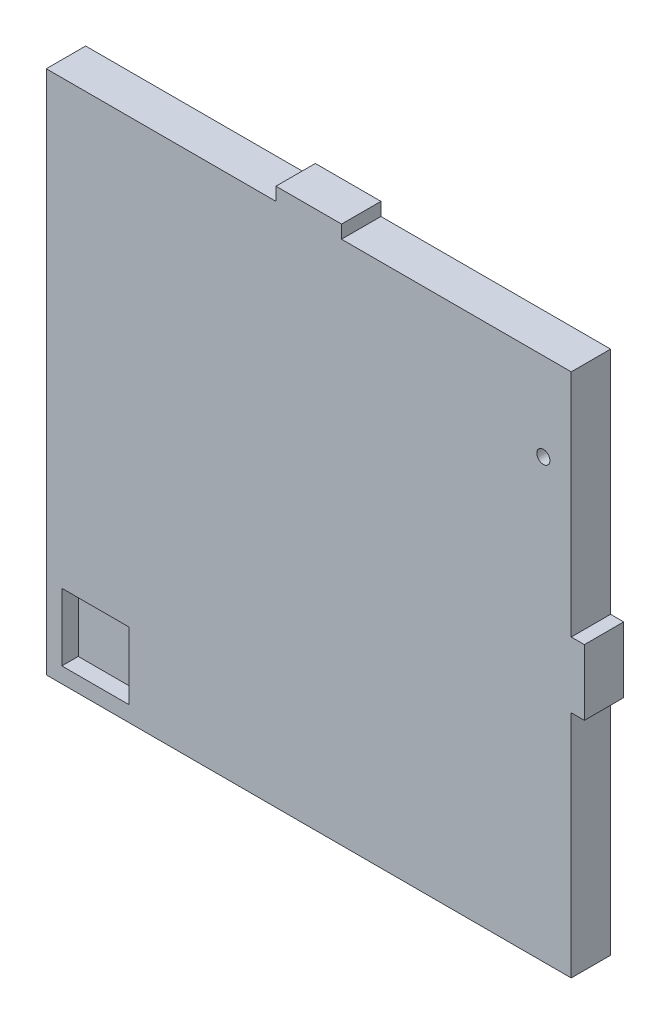
ISO-10303-21;
HEADER;
FILE_DESCRIPTION(('STEP AP214'),'2;1');
FILE_NAME('part.step','',(''),(''),'','','');
FILE_SCHEMA(('AUTOMOTIVE_DESIGN { 1 0 10303 214 1 1 1 1 }'));
ENDSEC;
DATA;
#1=APPLICATION_CONTEXT('core data for automotive mechanical design processes');
#2=APPLICATION_PROTOCOL_DEFINITION('international standard','automotive_design',2000,#1);
#3=PRODUCT_CONTEXT('',#1,'mechanical');
#4=PRODUCT('Part','Part','',(#3));
#5=PRODUCT_RELATED_PRODUCT_CATEGORY('part','',(#4));
#6=PRODUCT_DEFINITION_FORMATION('','',#4);
#7=PRODUCT_DEFINITION_CONTEXT('part definition',#1,'design');
#8=PRODUCT_DEFINITION('design','',#6,#7);
#9=PRODUCT_DEFINITION_SHAPE('','',#8);
#10=(LENGTH_UNIT() NAMED_UNIT(*) SI_UNIT(.MILLI.,.METRE.));
#11=(NAMED_UNIT(*) PLANE_ANGLE_UNIT() SI_UNIT($,.RADIAN.));
#12=(NAMED_UNIT(*) SI_UNIT($,.STERADIAN.) SOLID_ANGLE_UNIT());
#13=UNCERTAINTY_MEASURE_WITH_UNIT(LENGTH_MEASURE(1.E-05),#10,'distance_accuracy_value','');
#14=(GEOMETRIC_REPRESENTATION_CONTEXT(3) GLOBAL_UNCERTAINTY_ASSIGNED_CONTEXT((#13)) GLOBAL_UNIT_ASSIGNED_CONTEXT((#10,
#11,#12)) REPRESENTATION_CONTEXT('',''));
#15=CARTESIAN_POINT('',(0.,0.,0.));
#16=DIRECTION('',(0.,0.,1.));
#17=DIRECTION('',(1.,0.,0.));
#18=AXIS2_PLACEMENT_3D('',#15,#16,#17);
#19=CARTESIAN_POINT('',(151.500000000024,133.299999999993,12.));
#20=DIRECTION('',(0.,0.,-1.));
#21=DIRECTION('',(-1.,0.,0.));
#22=AXIS2_PLACEMENT_3D('',#19,#20,#21);
#23=CYLINDRICAL_SURFACE('',#22,2.);
#24=CARTESIAN_POINT('',(151.500000000024,133.299999999993,12.));
#25=DIRECTION('',(0.,0.,1.));
#26=DIRECTION('',(1.,0.,0.));
#27=AXIS2_PLACEMENT_3D('',#24,#25,#26);
#28=CIRCLE('',#27,2.);
#29=CARTESIAN_POINT('',(153.500000000024,133.299999999993,12.));
#30=VERTEX_POINT('',#29);
#31=EDGE_CURVE('E184',#30,#30,#28,.T.);
#32=ORIENTED_EDGE('',*,*,#31,.T.);
#33=EDGE_LOOP('',(#32));
#34=FACE_BOUND('',#33,.T.);
#35=CARTESIAN_POINT('',(151.500000000024,133.299999999993,8.));
#36=DIRECTION('',(0.,0.,-1.));
#37=DIRECTION('',(-1.,0.,0.));
#38=AXIS2_PLACEMENT_3D('',#35,#36,#37);
#39=CIRCLE('',#38,2.);
#40=CARTESIAN_POINT('',(149.500000000024,133.299999999993,8.));
#41=VERTEX_POINT('',#40);
#42=EDGE_CURVE('E44',#41,#41,#39,.T.);
#43=ORIENTED_EDGE('',*,*,#42,.T.);
#44=EDGE_LOOP('',(#43));
#45=FACE_BOUND('',#44,.T.);
#46=ADVANCED_FACE('F41',(#34,#45),#23,.F.);
#47=CARTESIAN_POINT('',(0.,0.,12.));
#48=DIRECTION('',(0.,0.,1.));
#49=DIRECTION('',(1.,0.,0.));
#50=AXIS2_PLACEMENT_3D('',#47,#48,#49);
#51=PLANE('',#50);
#52=DIRECTION('',(0.,-1.,0.));
#53=VECTOR('',#52,1.);
#54=CARTESIAN_POINT('',(4.75,25.25,12.));
#55=LINE('',#54,#53);
#56=CARTESIAN_POINT('',(4.75,25.25,12.));
#57=VERTEX_POINT('',#56);
#58=CARTESIAN_POINT('',(4.75,4.75,12.));
#59=VERTEX_POINT('',#58);
#60=EDGE_CURVE('E60',#57,#59,#55,.T.);
#61=ORIENTED_EDGE('',*,*,#60,.F.);
#62=DIRECTION('',(-1.,0.,0.));
#63=VECTOR('',#62,1.);
#64=CARTESIAN_POINT('',(25.25,25.25,12.));
#65=LINE('',#64,#63);
#66=CARTESIAN_POINT('',(25.25,25.25,12.));
#67=VERTEX_POINT('',#66);
#68=EDGE_CURVE('E454',#67,#57,#65,.T.);
#69=ORIENTED_EDGE('',*,*,#68,.F.);
#70=DIRECTION('',(0.,1.,0.));
#71=VECTOR('',#70,1.);
#72=CARTESIAN_POINT('',(25.25,4.75,12.));
#73=LINE('',#72,#71);
#74=CARTESIAN_POINT('',(25.25,4.75,12.));
#75=VERTEX_POINT('',#74);
#76=EDGE_CURVE('E468',#75,#67,#73,.T.);
#77=ORIENTED_EDGE('',*,*,#76,.F.);
#78=DIRECTION('',(1.,0.,0.));
#79=VECTOR('',#78,1.);
#80=CARTESIAN_POINT('',(4.75,4.75,12.));
#81=LINE('',#80,#79);
#82=EDGE_CURVE('E466',#59,#75,#81,.T.);
#83=ORIENTED_EDGE('',*,*,#82,.F.);
#84=EDGE_LOOP('',(#61,#69,#77,#83));
#85=FACE_BOUND('',#84,.T.);
#86=DIRECTION('',(0.,-1.,0.));
#87=VECTOR('',#86,1.);
#88=CARTESIAN_POINT('',(0.,69.7,12.));
#89=LINE('',#88,#87);
#90=CARTESIAN_POINT('',(0.,160.,12.));
#91=VERTEX_POINT('',#90);
#92=CARTESIAN_POINT('',(0.,0.,12.));
#93=VERTEX_POINT('',#92);
#94=EDGE_CURVE('E66',#91,#93,#89,.T.);
#95=ORIENTED_EDGE('',*,*,#94,.T.);
#96=DIRECTION('',(1.,0.,0.));
#97=VECTOR('',#96,1.);
#98=CARTESIAN_POINT('',(0.,0.,12.));
#99=LINE('',#98,#97);
#100=CARTESIAN_POINT('',(160.,0.,12.));
#101=VERTEX_POINT('',#100);
#102=EDGE_CURVE('E120',#93,#101,#99,.T.);
#103=ORIENTED_EDGE('',*,*,#102,.T.);
#104=DIRECTION('',(0.,1.,0.));
#105=VECTOR('',#104,1.);
#106=CARTESIAN_POINT('',(160.,0.,12.));
#107=LINE('',#106,#105);
#108=CARTESIAN_POINT('',(160.,70.,12.));
#109=VERTEX_POINT('',#108);
#110=EDGE_CURVE('E231',#101,#109,#107,.T.);
#111=ORIENTED_EDGE('',*,*,#110,.T.);
#112=DIRECTION('',(1.,0.,0.));
#113=VECTOR('',#112,1.);
#114=CARTESIAN_POINT('',(160.,70.,12.));
#115=LINE('',#114,#113);
#116=CARTESIAN_POINT('',(164.,70.,12.));
#117=VERTEX_POINT('',#116);
#118=EDGE_CURVE('E250',#109,#117,#115,.T.);
#119=ORIENTED_EDGE('',*,*,#118,.T.);
#120=DIRECTION('',(0.,1.,0.));
#121=VECTOR('',#120,1.);
#122=CARTESIAN_POINT('',(164.,70.,12.));
#123=LINE('',#122,#121);
#124=CARTESIAN_POINT('',(164.,90.,12.));
#125=VERTEX_POINT('',#124);
#126=EDGE_CURVE('E243',#117,#125,#123,.T.);
#127=ORIENTED_EDGE('',*,*,#126,.T.);
#128=DIRECTION('',(-1.,0.,0.));
#129=VECTOR('',#128,1.);
#130=CARTESIAN_POINT('',(164.,90.,12.));
#131=LINE('',#130,#129);
#132=CARTESIAN_POINT('',(160.,90.,12.));
#133=VERTEX_POINT('',#132);
#134=EDGE_CURVE('E246',#125,#133,#131,.T.);
#135=ORIENTED_EDGE('',*,*,#134,.T.);
#136=DIRECTION('',(0.,1.,0.));
#137=VECTOR('',#136,1.);
#138=CARTESIAN_POINT('',(160.,90.,12.));
#139=LINE('',#138,#137);
#140=CARTESIAN_POINT('',(160.,160.,12.));
#141=VERTEX_POINT('',#140);
#142=EDGE_CURVE('E248',#133,#141,#139,.T.);
#143=ORIENTED_EDGE('',*,*,#142,.T.);
#144=DIRECTION('',(-1.,0.,0.));
#145=VECTOR('',#144,1.);
#146=CARTESIAN_POINT('',(160.,160.,12.));
#147=LINE('',#146,#145);
#148=CARTESIAN_POINT('',(90.,160.,12.));
#149=VERTEX_POINT('',#148);
#150=EDGE_CURVE('E254',#141,#149,#147,.T.);
#151=ORIENTED_EDGE('',*,*,#150,.T.);
#152=DIRECTION('',(0.,1.,0.));
#153=VECTOR('',#152,1.);
#154=CARTESIAN_POINT('',(90.,160.,12.));
#155=LINE('',#154,#153);
#156=CARTESIAN_POINT('',(90.,164.,12.));
#157=VERTEX_POINT('',#156);
#158=EDGE_CURVE('E160',#149,#157,#155,.T.);
#159=ORIENTED_EDGE('',*,*,#158,.T.);
#160=DIRECTION('',(-1.,0.,0.));
#161=VECTOR('',#160,1.);
#162=CARTESIAN_POINT('',(90.,164.,12.));
#163=LINE('',#162,#161);
#164=CARTESIAN_POINT('',(70.,164.,12.));
#165=VERTEX_POINT('',#164);
#166=EDGE_CURVE('E149',#157,#165,#163,.T.);
#167=ORIENTED_EDGE('',*,*,#166,.T.);
#168=DIRECTION('',(0.,-1.,0.));
#169=VECTOR('',#168,1.);
#170=CARTESIAN_POINT('',(70.,164.,12.));
#171=LINE('',#170,#169);
#172=CARTESIAN_POINT('',(70.,160.,12.));
#173=VERTEX_POINT('',#172);
#174=EDGE_CURVE('E152',#165,#173,#171,.T.);
#175=ORIENTED_EDGE('',*,*,#174,.T.);
#176=DIRECTION('',(-1.,0.,0.));
#177=VECTOR('',#176,1.);
#178=CARTESIAN_POINT('',(70.,160.,12.));
#179=LINE('',#178,#177);
#180=EDGE_CURVE('E175',#173,#91,#179,.T.);
#181=ORIENTED_EDGE('',*,*,#180,.T.);
#182=EDGE_LOOP('',(#95,#103,#111,#119,#127,#135,#143,#151,#159,#167,#175,#181));
#183=FACE_BOUND('',#182,.T.);
#184=ORIENTED_EDGE('',*,*,#31,.F.);
#185=EDGE_LOOP('',(#184));
#186=FACE_BOUND('',#185,.T.);
#187=ADVANCED_FACE('F151',(#85,#183,#186),#51,.T.);
#188=CARTESIAN_POINT('',(0.,0.,0.));
#189=DIRECTION('',(0.,0.,1.));
#190=DIRECTION('',(1.,0.,0.));
#191=AXIS2_PLACEMENT_3D('',#188,#189,#190);
#192=PLANE('',#191);
#193=CARTESIAN_POINT('',(151.500000000026,133.299999999993,0.));
#194=DIRECTION('',(0.,0.,-1.));
#195=DIRECTION('',(-1.,0.,0.));
#196=AXIS2_PLACEMENT_3D('',#193,#194,#195);
#197=CIRCLE('',#196,3.45);
#198=CARTESIAN_POINT('',(148.050000000026,133.299999999993,0.));
#199=VERTEX_POINT('',#198);
#200=EDGE_CURVE('E446',#199,#199,#197,.T.);
#201=ORIENTED_EDGE('',*,*,#200,.F.);
#202=EDGE_LOOP('',(#201));
#203=FACE_BOUND('',#202,.T.);
#204=DIRECTION('',(1.,0.,0.));
#205=VECTOR('',#204,1.);
#206=CARTESIAN_POINT('',(90.3,0.,0.));
#207=LINE('',#206,#205);
#208=CARTESIAN_POINT('',(0.,0.,0.));
#209=VERTEX_POINT('',#208);
#210=CARTESIAN_POINT('',(160.,0.,0.));
#211=VERTEX_POINT('',#210);
#212=EDGE_CURVE('E182',#209,#211,#207,.T.);
#213=ORIENTED_EDGE('',*,*,#212,.F.);
#214=DIRECTION('',(0.,-1.,0.));
#215=VECTOR('',#214,1.);
#216=CARTESIAN_POINT('',(0.,90.3,0.));
#217=LINE('',#216,#215);
#218=CARTESIAN_POINT('',(0.,160.,0.));
#219=VERTEX_POINT('',#218);
#220=EDGE_CURVE('E115',#219,#209,#217,.T.);
#221=ORIENTED_EDGE('',*,*,#220,.F.);
#222=DIRECTION('',(-1.,0.,0.));
#223=VECTOR('',#222,1.);
#224=CARTESIAN_POINT('',(70.,160.,0.));
#225=LINE('',#224,#223);
#226=CARTESIAN_POINT('',(70.,160.,0.));
#227=VERTEX_POINT('',#226);
#228=EDGE_CURVE('E203',#227,#219,#225,.T.);
#229=ORIENTED_EDGE('',*,*,#228,.F.);
#230=DIRECTION('',(0.,-1.,0.));
#231=VECTOR('',#230,1.);
#232=CARTESIAN_POINT('',(70.,164.,0.));
#233=LINE('',#232,#231);
#234=CARTESIAN_POINT('',(70.,164.,0.));
#235=VERTEX_POINT('',#234);
#236=EDGE_CURVE('E200',#235,#227,#233,.T.);
#237=ORIENTED_EDGE('',*,*,#236,.F.);
#238=DIRECTION('',(-1.,0.,0.));
#239=VECTOR('',#238,1.);
#240=CARTESIAN_POINT('',(90.,164.,0.));
#241=LINE('',#240,#239);
#242=CARTESIAN_POINT('',(90.,164.,0.));
#243=VERTEX_POINT('',#242);
#244=EDGE_CURVE('E167',#243,#235,#241,.T.);
#245=ORIENTED_EDGE('',*,*,#244,.F.);
#246=DIRECTION('',(0.,1.,0.));
#247=VECTOR('',#246,1.);
#248=CARTESIAN_POINT('',(90.,160.,0.));
#249=LINE('',#248,#247);
#250=CARTESIAN_POINT('',(90.,160.,0.));
#251=VERTEX_POINT('',#250);
#252=EDGE_CURVE('E198',#251,#243,#249,.T.);
#253=ORIENTED_EDGE('',*,*,#252,.F.);
#254=DIRECTION('',(-1.,0.,0.));
#255=VECTOR('',#254,1.);
#256=CARTESIAN_POINT('',(160.,160.,0.));
#257=LINE('',#256,#255);
#258=CARTESIAN_POINT('',(160.,160.,0.));
#259=VERTEX_POINT('',#258);
#260=EDGE_CURVE('E193',#259,#251,#257,.T.);
#261=ORIENTED_EDGE('',*,*,#260,.F.);
#262=DIRECTION('',(0.,1.,0.));
#263=VECTOR('',#262,1.);
#264=CARTESIAN_POINT('',(160.,90.,0.));
#265=LINE('',#264,#263);
#266=CARTESIAN_POINT('',(160.,90.,0.));
#267=VERTEX_POINT('',#266);
#268=EDGE_CURVE('E195',#267,#259,#265,.T.);
#269=ORIENTED_EDGE('',*,*,#268,.F.);
#270=DIRECTION('',(-1.,0.,0.));
#271=VECTOR('',#270,1.);
#272=CARTESIAN_POINT('',(164.,90.,0.));
#273=LINE('',#272,#271);
#274=CARTESIAN_POINT('',(164.,90.,0.));
#275=VERTEX_POINT('',#274);
#276=EDGE_CURVE('E190',#275,#267,#273,.T.);
#277=ORIENTED_EDGE('',*,*,#276,.F.);
#278=DIRECTION('',(0.,1.,0.));
#279=VECTOR('',#278,1.);
#280=CARTESIAN_POINT('',(164.,70.,0.));
#281=LINE('',#280,#279);
#282=CARTESIAN_POINT('',(164.,70.,0.));
#283=VERTEX_POINT('',#282);
#284=EDGE_CURVE('E189',#283,#275,#281,.T.);
#285=ORIENTED_EDGE('',*,*,#284,.F.);
#286=DIRECTION('',(1.,0.,0.));
#287=VECTOR('',#286,1.);
#288=CARTESIAN_POINT('',(160.,70.,0.));
#289=LINE('',#288,#287);
#290=CARTESIAN_POINT('',(160.,70.,0.));
#291=VERTEX_POINT('',#290);
#292=EDGE_CURVE('E186',#291,#283,#289,.T.);
#293=ORIENTED_EDGE('',*,*,#292,.F.);
#294=DIRECTION('',(0.,1.,0.));
#295=VECTOR('',#294,1.);
#296=CARTESIAN_POINT('',(160.,0.,0.));
#297=LINE('',#296,#295);
#298=EDGE_CURVE('E181',#211,#291,#297,.T.);
#299=ORIENTED_EDGE('',*,*,#298,.F.);
#300=EDGE_LOOP('',(#213,#221,#229,#237,#245,#253,#261,#269,#277,#285,#293,#299));
#301=FACE_BOUND('',#300,.T.);
#302=ADVANCED_FACE('F232',(#203,#301),#192,.F.);
#303=CARTESIAN_POINT('',(90.3,0.,12.));
#304=DIRECTION('',(0.,1.,0.));
#305=DIRECTION('',(0.,0.,1.));
#306=AXIS2_PLACEMENT_3D('',#303,#304,#305);
#307=PLANE('',#306);
#308=ORIENTED_EDGE('',*,*,#212,.T.);
#309=DIRECTION('',(0.,0.,-1.));
#310=VECTOR('',#309,1.);
#311=CARTESIAN_POINT('',(160.,0.,12.));
#312=LINE('',#311,#310);
#313=EDGE_CURVE('E49',#101,#211,#312,.T.);
#314=ORIENTED_EDGE('',*,*,#313,.F.);
#315=ORIENTED_EDGE('',*,*,#102,.F.);
#316=DIRECTION('',(0.,0.,-1.));
#317=VECTOR('',#316,1.);
#318=CARTESIAN_POINT('',(0.,0.,12.));
#319=LINE('',#318,#317);
#320=EDGE_CURVE('E11',#93,#209,#319,.T.);
#321=ORIENTED_EDGE('',*,*,#320,.T.);
#322=EDGE_LOOP('',(#308,#314,#315,#321));
#323=FACE_BOUND('',#322,.T.);
#324=ADVANCED_FACE('F43',(#323),#307,.F.);
#325=CARTESIAN_POINT('',(160.,0.,12.));
#326=DIRECTION('',(-1.,0.,0.));
#327=DIRECTION('',(0.,0.,1.));
#328=AXIS2_PLACEMENT_3D('',#325,#326,#327);
#329=PLANE('',#328);
#330=ORIENTED_EDGE('',*,*,#298,.T.);
#331=DIRECTION('',(0.,0.,-1.));
#332=VECTOR('',#331,1.);
#333=CARTESIAN_POINT('',(160.,70.,12.));
#334=LINE('',#333,#332);
#335=EDGE_CURVE('E225',#109,#291,#334,.T.);
#336=ORIENTED_EDGE('',*,*,#335,.F.);
#337=ORIENTED_EDGE('',*,*,#110,.F.);
#338=ORIENTED_EDGE('',*,*,#313,.T.);
#339=EDGE_LOOP('',(#330,#336,#337,#338));
#340=FACE_BOUND('',#339,.T.);
#341=ADVANCED_FACE('F228',(#340),#329,.F.);
#342=CARTESIAN_POINT('',(160.,70.,12.));
#343=DIRECTION('',(0.,1.,0.));
#344=DIRECTION('',(0.,0.,1.));
#345=AXIS2_PLACEMENT_3D('',#342,#343,#344);
#346=PLANE('',#345);
#347=ORIENTED_EDGE('',*,*,#292,.T.);
#348=DIRECTION('',(0.,0.,-1.));
#349=VECTOR('',#348,1.);
#350=CARTESIAN_POINT('',(164.,70.,12.));
#351=LINE('',#350,#349);
#352=EDGE_CURVE('E218',#117,#283,#351,.T.);
#353=ORIENTED_EDGE('',*,*,#352,.F.);
#354=ORIENTED_EDGE('',*,*,#118,.F.);
#355=ORIENTED_EDGE('',*,*,#335,.T.);
#356=EDGE_LOOP('',(#347,#353,#354,#355));
#357=FACE_BOUND('',#356,.T.);
#358=ADVANCED_FACE('F236',(#357),#346,.F.);
#359=CARTESIAN_POINT('',(164.,70.,12.));
#360=DIRECTION('',(-1.,0.,0.));
#361=DIRECTION('',(0.,0.,1.));
#362=AXIS2_PLACEMENT_3D('',#359,#360,#361);
#363=PLANE('',#362);
#364=ORIENTED_EDGE('',*,*,#284,.T.);
#365=DIRECTION('',(0.,0.,-1.));
#366=VECTOR('',#365,1.);
#367=CARTESIAN_POINT('',(164.,90.,12.));
#368=LINE('',#367,#366);
#369=EDGE_CURVE('E216',#125,#275,#368,.T.);
#370=ORIENTED_EDGE('',*,*,#369,.F.);
#371=ORIENTED_EDGE('',*,*,#126,.F.);
#372=ORIENTED_EDGE('',*,*,#352,.T.);
#373=EDGE_LOOP('',(#364,#370,#371,#372));
#374=FACE_BOUND('',#373,.T.);
#375=ADVANCED_FACE('F242',(#374),#363,.F.);
#376=CARTESIAN_POINT('',(164.,90.,12.));
#377=DIRECTION('',(0.,-1.,0.));
#378=DIRECTION('',(0.,0.,-1.));
#379=AXIS2_PLACEMENT_3D('',#376,#377,#378);
#380=PLANE('',#379);
#381=ORIENTED_EDGE('',*,*,#276,.T.);
#382=DIRECTION('',(0.,0.,-1.));
#383=VECTOR('',#382,1.);
#384=CARTESIAN_POINT('',(160.,90.,12.));
#385=LINE('',#384,#383);
#386=EDGE_CURVE('E213',#133,#267,#385,.T.);
#387=ORIENTED_EDGE('',*,*,#386,.F.);
#388=ORIENTED_EDGE('',*,*,#134,.F.);
#389=ORIENTED_EDGE('',*,*,#369,.T.);
#390=EDGE_LOOP('',(#381,#387,#388,#389));
#391=FACE_BOUND('',#390,.T.);
#392=ADVANCED_FACE('F306',(#391),#380,.F.);
#393=CARTESIAN_POINT('',(160.,90.,12.));
#394=DIRECTION('',(-1.,0.,0.));
#395=DIRECTION('',(0.,0.,1.));
#396=AXIS2_PLACEMENT_3D('',#393,#394,#395);
#397=PLANE('',#396);
#398=ORIENTED_EDGE('',*,*,#268,.T.);
#399=DIRECTION('',(0.,0.,-1.));
#400=VECTOR('',#399,1.);
#401=CARTESIAN_POINT('',(160.,160.,12.));
#402=LINE('',#401,#400);
#403=EDGE_CURVE('E209',#141,#259,#402,.T.);
#404=ORIENTED_EDGE('',*,*,#403,.F.);
#405=ORIENTED_EDGE('',*,*,#142,.F.);
#406=ORIENTED_EDGE('',*,*,#386,.T.);
#407=EDGE_LOOP('',(#398,#404,#405,#406));
#408=FACE_BOUND('',#407,.T.);
#409=ADVANCED_FACE('F304',(#408),#397,.F.);
#410=CARTESIAN_POINT('',(160.,160.,12.));
#411=DIRECTION('',(0.,-1.,0.));
#412=DIRECTION('',(0.,0.,-1.));
#413=AXIS2_PLACEMENT_3D('',#410,#411,#412);
#414=PLANE('',#413);
#415=ORIENTED_EDGE('',*,*,#260,.T.);
#416=DIRECTION('',(0.,0.,-1.));
#417=VECTOR('',#416,1.);
#418=CARTESIAN_POINT('',(90.,160.,12.));
#419=LINE('',#418,#417);
#420=EDGE_CURVE('E210',#149,#251,#419,.T.);
#421=ORIENTED_EDGE('',*,*,#420,.F.);
#422=ORIENTED_EDGE('',*,*,#150,.F.);
#423=ORIENTED_EDGE('',*,*,#403,.T.);
#424=EDGE_LOOP('',(#415,#421,#422,#423));
#425=FACE_BOUND('',#424,.T.);
#426=ADVANCED_FACE('F261',(#425),#414,.F.);
#427=CARTESIAN_POINT('',(90.,160.,12.));
#428=DIRECTION('',(-1.,0.,0.));
#429=DIRECTION('',(0.,0.,1.));
#430=AXIS2_PLACEMENT_3D('',#427,#428,#429);
#431=PLANE('',#430);
#432=ORIENTED_EDGE('',*,*,#252,.T.);
#433=DIRECTION('',(0.,0.,-1.));
#434=VECTOR('',#433,1.);
#435=CARTESIAN_POINT('',(90.,164.,12.));
#436=LINE('',#435,#434);
#437=EDGE_CURVE('E166',#157,#243,#436,.T.);
#438=ORIENTED_EDGE('',*,*,#437,.F.);
#439=ORIENTED_EDGE('',*,*,#158,.F.);
#440=ORIENTED_EDGE('',*,*,#420,.T.);
#441=EDGE_LOOP('',(#432,#438,#439,#440));
#442=FACE_BOUND('',#441,.T.);
#443=ADVANCED_FACE('F264',(#442),#431,.F.);
#444=CARTESIAN_POINT('',(90.,164.,12.));
#445=DIRECTION('',(0.,-1.,0.));
#446=DIRECTION('',(0.,0.,-1.));
#447=AXIS2_PLACEMENT_3D('',#444,#445,#446);
#448=PLANE('',#447);
#449=ORIENTED_EDGE('',*,*,#244,.T.);
#450=DIRECTION('',(0.,0.,-1.));
#451=VECTOR('',#450,1.);
#452=CARTESIAN_POINT('',(70.,164.,12.));
#453=LINE('',#452,#451);
#454=EDGE_CURVE('E162',#165,#235,#453,.T.);
#455=ORIENTED_EDGE('',*,*,#454,.F.);
#456=ORIENTED_EDGE('',*,*,#166,.F.);
#457=ORIENTED_EDGE('',*,*,#437,.T.);
#458=EDGE_LOOP('',(#449,#455,#456,#457));
#459=FACE_BOUND('',#458,.T.);
#460=ADVANCED_FACE('F163',(#459),#448,.F.);
#461=CARTESIAN_POINT('',(70.,164.,12.));
#462=DIRECTION('',(1.,0.,0.));
#463=DIRECTION('',(0.,0.,-1.));
#464=AXIS2_PLACEMENT_3D('',#461,#462,#463);
#465=PLANE('',#464);
#466=ORIENTED_EDGE('',*,*,#236,.T.);
#467=DIRECTION('',(0.,0.,-1.));
#468=VECTOR('',#467,1.);
#469=CARTESIAN_POINT('',(70.,160.,12.));
#470=LINE('',#469,#468);
#471=EDGE_CURVE('E168',#173,#227,#470,.T.);
#472=ORIENTED_EDGE('',*,*,#471,.F.);
#473=ORIENTED_EDGE('',*,*,#174,.F.);
#474=ORIENTED_EDGE('',*,*,#454,.T.);
#475=EDGE_LOOP('',(#466,#472,#473,#474));
#476=FACE_BOUND('',#475,.T.);
#477=ADVANCED_FACE('F172',(#476),#465,.F.);
#478=CARTESIAN_POINT('',(70.,160.,12.));
#479=DIRECTION('',(0.,-1.,0.));
#480=DIRECTION('',(0.,0.,-1.));
#481=AXIS2_PLACEMENT_3D('',#478,#479,#480);
#482=PLANE('',#481);
#483=ORIENTED_EDGE('',*,*,#228,.T.);
#484=DIRECTION('',(0.,0.,-1.));
#485=VECTOR('',#484,1.);
#486=CARTESIAN_POINT('',(0.,160.,12.));
#487=LINE('',#486,#485);
#488=EDGE_CURVE('E180',#91,#219,#487,.T.);
#489=ORIENTED_EDGE('',*,*,#488,.F.);
#490=ORIENTED_EDGE('',*,*,#180,.F.);
#491=ORIENTED_EDGE('',*,*,#471,.T.);
#492=EDGE_LOOP('',(#483,#489,#490,#491));
#493=FACE_BOUND('',#492,.T.);
#494=ADVANCED_FACE('F270',(#493),#482,.F.);
#495=CARTESIAN_POINT('',(0.,90.3,12.));
#496=DIRECTION('',(1.,0.,0.));
#497=DIRECTION('',(0.,0.,-1.));
#498=AXIS2_PLACEMENT_3D('',#495,#496,#497);
#499=PLANE('',#498);
#500=ORIENTED_EDGE('',*,*,#220,.T.);
#501=ORIENTED_EDGE('',*,*,#320,.F.);
#502=ORIENTED_EDGE('',*,*,#94,.F.);
#503=ORIENTED_EDGE('',*,*,#488,.T.);
#504=EDGE_LOOP('',(#500,#501,#502,#503));
#505=FACE_BOUND('',#504,.T.);
#506=ADVANCED_FACE('F269',(#505),#499,.F.);
#507=CARTESIAN_POINT('',(4.75,25.25,7.));
#508=DIRECTION('',(-1.,0.,0.));
#509=DIRECTION('',(0.,0.,1.));
#510=AXIS2_PLACEMENT_3D('',#507,#508,#509);
#511=PLANE('',#510);
#512=ORIENTED_EDGE('',*,*,#60,.T.);
#513=DIRECTION('',(0.,0.,1.));
#514=VECTOR('',#513,1.);
#515=CARTESIAN_POINT('',(4.75,4.75,7.));
#516=LINE('',#515,#514);
#517=CARTESIAN_POINT('',(4.75,4.75,7.));
#518=VERTEX_POINT('',#517);
#519=EDGE_CURVE('E463',#518,#59,#516,.T.);
#520=ORIENTED_EDGE('',*,*,#519,.F.);
#521=DIRECTION('',(0.,-1.,0.));
#522=VECTOR('',#521,1.);
#523=CARTESIAN_POINT('',(4.75,25.25,7.));
#524=LINE('',#523,#522);
#525=CARTESIAN_POINT('',(4.75,25.25,7.));
#526=VERTEX_POINT('',#525);
#527=EDGE_CURVE('E451',#526,#518,#524,.T.);
#528=ORIENTED_EDGE('',*,*,#527,.F.);
#529=DIRECTION('',(0.,0.,1.));
#530=VECTOR('',#529,1.);
#531=CARTESIAN_POINT('',(4.75,25.25,7.));
#532=LINE('',#531,#530);
#533=EDGE_CURVE('E475',#526,#57,#532,.T.);
#534=ORIENTED_EDGE('',*,*,#533,.T.);
#535=EDGE_LOOP('',(#512,#520,#528,#534));
#536=FACE_BOUND('',#535,.T.);
#537=ADVANCED_FACE('F289',(#536),#511,.F.);
#538=CARTESIAN_POINT('',(25.25,25.25,7.));
#539=DIRECTION('',(0.,1.,0.));
#540=DIRECTION('',(0.,0.,1.));
#541=AXIS2_PLACEMENT_3D('',#538,#539,#540);
#542=PLANE('',#541);
#543=ORIENTED_EDGE('',*,*,#68,.T.);
#544=ORIENTED_EDGE('',*,*,#533,.F.);
#545=DIRECTION('',(-1.,0.,0.));
#546=VECTOR('',#545,1.);
#547=CARTESIAN_POINT('',(25.25,25.25,7.));
#548=LINE('',#547,#546);
#549=CARTESIAN_POINT('',(25.25,25.25,7.));
#550=VERTEX_POINT('',#549);
#551=EDGE_CURVE('E461',#550,#526,#548,.T.);
#552=ORIENTED_EDGE('',*,*,#551,.F.);
#553=DIRECTION('',(0.,0.,1.));
#554=VECTOR('',#553,1.);
#555=CARTESIAN_POINT('',(25.25,25.25,7.));
#556=LINE('',#555,#554);
#557=EDGE_CURVE('E478',#550,#67,#556,.T.);
#558=ORIENTED_EDGE('',*,*,#557,.T.);
#559=EDGE_LOOP('',(#543,#544,#552,#558));
#560=FACE_BOUND('',#559,.T.);
#561=ADVANCED_FACE('F377',(#560),#542,.F.);
#562=CARTESIAN_POINT('',(25.25,4.75,7.));
#563=DIRECTION('',(1.,0.,0.));
#564=DIRECTION('',(0.,0.,-1.));
#565=AXIS2_PLACEMENT_3D('',#562,#563,#564);
#566=PLANE('',#565);
#567=ORIENTED_EDGE('',*,*,#76,.T.);
#568=ORIENTED_EDGE('',*,*,#557,.F.);
#569=DIRECTION('',(0.,1.,0.));
#570=VECTOR('',#569,1.);
#571=CARTESIAN_POINT('',(25.25,4.75,7.));
#572=LINE('',#571,#570);
#573=CARTESIAN_POINT('',(25.25,4.75,7.));
#574=VERTEX_POINT('',#573);
#575=EDGE_CURVE('E456',#574,#550,#572,.T.);
#576=ORIENTED_EDGE('',*,*,#575,.F.);
#577=DIRECTION('',(0.,0.,1.));
#578=VECTOR('',#577,1.);
#579=CARTESIAN_POINT('',(25.25,4.75,7.));
#580=LINE('',#579,#578);
#581=EDGE_CURVE('E479',#574,#75,#580,.T.);
#582=ORIENTED_EDGE('',*,*,#581,.T.);
#583=EDGE_LOOP('',(#567,#568,#576,#582));
#584=FACE_BOUND('',#583,.T.);
#585=ADVANCED_FACE('F387',(#584),#566,.F.);
#586=CARTESIAN_POINT('',(4.75,4.75,7.));
#587=DIRECTION('',(0.,-1.,0.));
#588=DIRECTION('',(0.,0.,-1.));
#589=AXIS2_PLACEMENT_3D('',#586,#587,#588);
#590=PLANE('',#589);
#591=ORIENTED_EDGE('',*,*,#82,.T.);
#592=ORIENTED_EDGE('',*,*,#581,.F.);
#593=DIRECTION('',(1.,0.,0.));
#594=VECTOR('',#593,1.);
#595=CARTESIAN_POINT('',(4.75,4.75,7.));
#596=LINE('',#595,#594);
#597=EDGE_CURVE('E453',#518,#574,#596,.T.);
#598=ORIENTED_EDGE('',*,*,#597,.F.);
#599=ORIENTED_EDGE('',*,*,#519,.T.);
#600=EDGE_LOOP('',(#591,#592,#598,#599));
#601=FACE_BOUND('',#600,.T.);
#602=ADVANCED_FACE('F395',(#601),#590,.F.);
#603=CARTESIAN_POINT('',(0.,0.,7.));
#604=DIRECTION('',(0.,0.,1.));
#605=DIRECTION('',(1.,0.,0.));
#606=AXIS2_PLACEMENT_3D('',#603,#604,#605);
#607=PLANE('',#606);
#608=ORIENTED_EDGE('',*,*,#527,.T.);
#609=ORIENTED_EDGE('',*,*,#597,.T.);
#610=ORIENTED_EDGE('',*,*,#575,.T.);
#611=ORIENTED_EDGE('',*,*,#551,.T.);
#612=EDGE_LOOP('',(#608,#609,#610,#611));
#613=FACE_BOUND('',#612,.T.);
#614=ADVANCED_FACE('F401',(#613),#607,.T.);
#615=CARTESIAN_POINT('',(151.500000000026,133.299999999993,8.));
#616=DIRECTION('',(0.,0.,-1.));
#617=DIRECTION('',(-1.,0.,0.));
#618=AXIS2_PLACEMENT_3D('',#615,#616,#617);
#619=CYLINDRICAL_SURFACE('',#618,3.45);
#620=CARTESIAN_POINT('',(151.500000000026,133.299999999993,8.));
#621=DIRECTION('',(0.,0.,-1.));
#622=DIRECTION('',(-1.,0.,0.));
#623=AXIS2_PLACEMENT_3D('',#620,#621,#622);
#624=CIRCLE('',#623,3.45);
#625=CARTESIAN_POINT('',(148.050000000026,133.299999999993,8.));
#626=VERTEX_POINT('',#625);
#627=EDGE_CURVE('E443',#626,#626,#624,.T.);
#628=ORIENTED_EDGE('',*,*,#627,.F.);
#629=EDGE_LOOP('',(#628));
#630=FACE_BOUND('',#629,.T.);
#631=ORIENTED_EDGE('',*,*,#200,.T.);
#632=EDGE_LOOP('',(#631));
#633=FACE_BOUND('',#632,.T.);
#634=ADVANCED_FACE('F410',(#630,#633),#619,.F.);
#635=CARTESIAN_POINT('',(151.500000000026,133.299999999993,8.));
#636=DIRECTION('',(0.,0.,-1.));
#637=DIRECTION('',(-1.,0.,0.));
#638=AXIS2_PLACEMENT_3D('',#635,#636,#637);
#639=PLANE('',#638);
#640=ORIENTED_EDGE('',*,*,#42,.F.);
#641=EDGE_LOOP('',(#640));
#642=FACE_BOUND('',#641,.T.);
#643=ORIENTED_EDGE('',*,*,#627,.T.);
#644=EDGE_LOOP('',(#643));
#645=FACE_BOUND('',#644,.T.);
#646=ADVANCED_FACE('F430',(#642,#645),#639,.T.);
#647=CLOSED_SHELL('',(#46,#187,#302,#324,#341,#358,#375,#392,#409,#426,#443,#460,#477,#494,#506,
#537,#561,#585,#602,#614,#634,#646));
#648=MANIFOLD_SOLID_BREP('B2',#647);
#649=ADVANCED_BREP_SHAPE_REPRESENTATION('',(#18,#648),#14);
#650=SHAPE_DEFINITION_REPRESENTATION(#9,#649);
ENDSEC;
END-ISO-10303-21;
